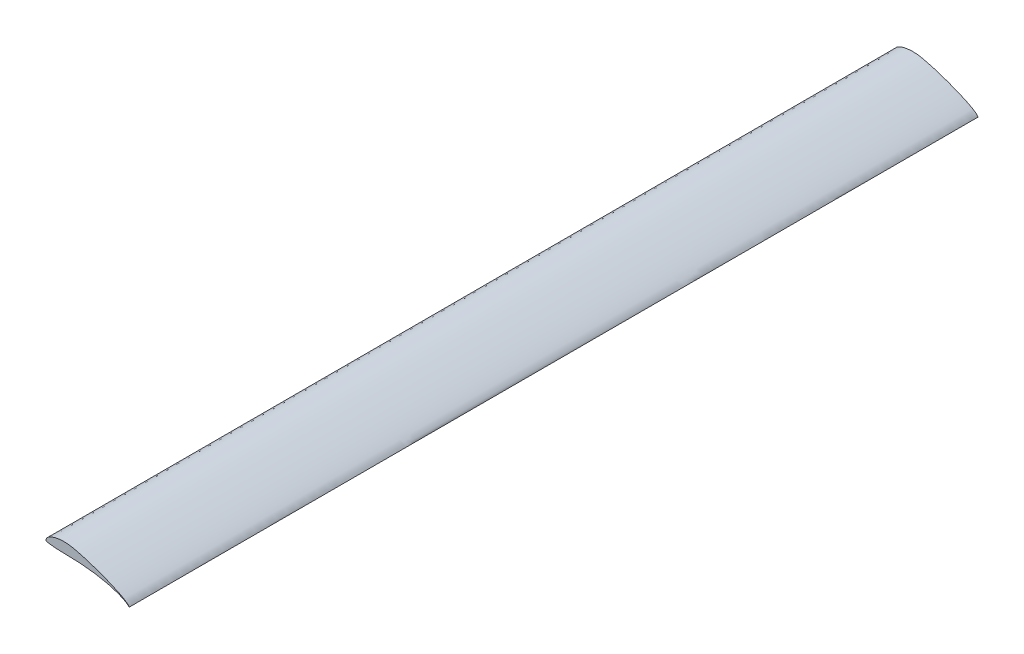
ISO-10303-21;
HEADER;
FILE_DESCRIPTION(('STEP AP214'),'2;1');
FILE_NAME('part.step','',(''),(''),'','','');
FILE_SCHEMA(('AUTOMOTIVE_DESIGN { 1 0 10303 214 1 1 1 1 }'));
ENDSEC;
DATA;
#1=APPLICATION_CONTEXT('core data for automotive mechanical design processes');
#2=APPLICATION_PROTOCOL_DEFINITION('international standard','automotive_design',2000,#1);
#3=PRODUCT_CONTEXT('',#1,'mechanical');
#4=PRODUCT('Part','Part','',(#3));
#5=PRODUCT_RELATED_PRODUCT_CATEGORY('part','',(#4));
#6=PRODUCT_DEFINITION_FORMATION('','',#4);
#7=PRODUCT_DEFINITION_CONTEXT('part definition',#1,'design');
#8=PRODUCT_DEFINITION('design','',#6,#7);
#9=PRODUCT_DEFINITION_SHAPE('','',#8);
#10=(LENGTH_UNIT() NAMED_UNIT(*) SI_UNIT(.MILLI.,.METRE.));
#11=(NAMED_UNIT(*) PLANE_ANGLE_UNIT() SI_UNIT($,.RADIAN.));
#12=(NAMED_UNIT(*) SI_UNIT($,.STERADIAN.) SOLID_ANGLE_UNIT());
#13=UNCERTAINTY_MEASURE_WITH_UNIT(LENGTH_MEASURE(1.E-05),#10,'distance_accuracy_value','');
#14=(GEOMETRIC_REPRESENTATION_CONTEXT(3) GLOBAL_UNCERTAINTY_ASSIGNED_CONTEXT((#13)) GLOBAL_UNIT_ASSIGNED_CONTEXT((#10,
#11,#12)) REPRESENTATION_CONTEXT('',''));
#15=CARTESIAN_POINT('',(0.,0.,0.));
#16=DIRECTION('',(0.,0.,1.));
#17=DIRECTION('',(1.,0.,0.));
#18=AXIS2_PLACEMENT_3D('',#15,#16,#17);
#19=CARTESIAN_POINT('',(17.989875606032,-2.31342529155645,200.));
#20=CARTESIAN_POINT('',(17.9900955759807,-2.31295077492719,200.));
#21=CARTESIAN_POINT('',(17.9355821721171,-2.25171028805099,200.));
#22=CARTESIAN_POINT('',(17.8921271370401,-2.18705956026446,200.));
#23=CARTESIAN_POINT('',(17.7941899806624,-2.05054654714839,200.));
#24=CARTESIAN_POINT('',(17.6759816445532,-1.90243497501113,200.));
#25=CARTESIAN_POINT('',(17.5054846639197,-1.74255060358561,200.));
#26=CARTESIAN_POINT('',(17.286706277002,-1.57657640546879,200.));
#27=CARTESIAN_POINT('',(17.0186805989894,-1.39518516312656,200.));
#28=CARTESIAN_POINT('',(16.7015070323307,-1.20015444271159,200.));
#29=CARTESIAN_POINT('',(16.3366038092009,-0.992692624888009,200.));
#30=CARTESIAN_POINT('',(15.9257740120669,-0.774319819323117,200.));
#31=CARTESIAN_POINT('',(15.4713421218862,-0.54614256974998,200.));
#32=CARTESIAN_POINT('',(14.9757199852916,-0.309893360015332,200.));
#33=CARTESIAN_POINT('',(14.441709218769,-0.067120474682841,200.));
#34=CARTESIAN_POINT('',(13.8724851612771,0.180692698856569,200.));
#35=CARTESIAN_POINT('',(13.2715486730058,0.432153869299972,200.));
#36=CARTESIAN_POINT('',(12.6422489501155,0.685001870645397,200.));
#37=CARTESIAN_POINT('',(11.9886673549607,0.938220063257689,200.));
#38=CARTESIAN_POINT('',(11.3144038220128,1.18953967406809,200.));
#39=CARTESIAN_POINT('',(10.6240058979081,1.43824372063685,200.));
#40=CARTESIAN_POINT('',(9.92186631227948,1.68258343046333,200.));
#41=CARTESIAN_POINT('',(9.21315033148976,1.92117587057976,200.));
#42=CARTESIAN_POINT('',(8.50379949071679,2.15345325871646,200.));
#43=CARTESIAN_POINT('',(7.79939746752808,2.37609093829875,200.));
#44=CARTESIAN_POINT('',(7.10552094655799,2.58648866106916,200.));
#45=CARTESIAN_POINT('',(6.42639332453486,2.77997772947287,200.));
#46=CARTESIAN_POINT('',(5.76538833395988,2.95299745399572,200.));
#47=CARTESIAN_POINT('',(5.12539026782157,3.10073438268136,200.));
#48=CARTESIAN_POINT('',(4.51035220960202,3.22570655871951,200.));
#49=CARTESIAN_POINT('',(3.91903918986305,3.31611377082621,200.));
#50=CARTESIAN_POINT('',(3.35072558378545,3.36957995026956,200.));
#51=CARTESIAN_POINT('',(2.80431112319163,3.39221351392038,200.));
#52=CARTESIAN_POINT('',(2.27962030774589,3.38380811319263,200.));
#53=CARTESIAN_POINT('',(1.77844451885555,3.35045314201531,200.));
#54=CARTESIAN_POINT('',(1.30326803188107,3.29405587149475,200.));
#55=CARTESIAN_POINT('',(0.856694825030588,3.21768739311276,200.));
#56=CARTESIAN_POINT('',(0.441471470520792,3.12168395508999,200.));
#57=CARTESIAN_POINT('',(0.0595426789915003,3.00933040209943,200.));
#58=CARTESIAN_POINT('',(-0.286789882035727,2.88232488069579,200.));
#59=CARTESIAN_POINT('',(-0.595069068977497,2.74284892459154,200.));
#60=CARTESIAN_POINT('',(-0.864334258484831,2.59500680995849,200.));
#61=CARTESIAN_POINT('',(-1.09170154337654,2.43598544788783,200.));
#62=CARTESIAN_POINT('',(-1.2759304370733,2.26731200598163,200.));
#63=CARTESIAN_POINT('',(-1.42157568215839,2.09629836059321,200.));
#64=CARTESIAN_POINT('',(-1.52717283809488,1.92719727195777,200.));
#65=CARTESIAN_POINT('',(-1.59432568538348,1.76487396573081,200.));
#66=CARTESIAN_POINT('',(-1.61751616546988,1.62066595953141,200.));
#67=CARTESIAN_POINT('',(-1.60771691058695,1.48200535980992,200.));
#68=CARTESIAN_POINT('',(-1.48434226282254,1.38876592667072,200.));
#69=CARTESIAN_POINT('',(-1.30232537675106,1.34176299476044,200.));
#70=CARTESIAN_POINT('',(-1.05257716226974,1.28110379727931,200.));
#71=CARTESIAN_POINT('',(-0.733399866275488,1.22959001554564,200.));
#72=CARTESIAN_POINT('',(-0.350647348448999,1.17689579587441,200.));
#73=CARTESIAN_POINT('',(0.0922317685020536,1.127545464913,200.));
#74=CARTESIAN_POINT('',(0.590602883989543,1.08154525422087,200.));
#75=CARTESIAN_POINT('',(1.14233050193094,1.04055035926927,200.));
#76=CARTESIAN_POINT('',(1.74969843745423,1.01697908646355,200.));
#77=CARTESIAN_POINT('',(2.41495394823145,1.0072694181929,200.));
#78=CARTESIAN_POINT('',(3.13842433738461,0.996813392648537,200.));
#79=CARTESIAN_POINT('',(3.91601474934605,0.982949864025493,200.));
#80=CARTESIAN_POINT('',(4.74182303711181,0.960822687616571,200.));
#81=CARTESIAN_POINT('',(5.6089021222364,0.926310274523661,200.));
#82=CARTESIAN_POINT('',(6.50979551598842,0.876137643130922,200.));
#83=CARTESIAN_POINT('',(7.43598875571879,0.807092598183633,200.));
#84=CARTESIAN_POINT('',(8.37866893393879,0.717446400430352,200.));
#85=CARTESIAN_POINT('',(9.32819937243037,0.60449239568797,200.));
#86=CARTESIAN_POINT('',(10.2747901806382,0.468096237432833,200.));
#87=CARTESIAN_POINT('',(11.2082150938344,0.308047474429827,200.));
#88=CARTESIAN_POINT('',(12.118069179501,0.12472809953694,200.));
#89=CARTESIAN_POINT('',(12.9941559711104,-0.0800381776970565,200.));
#90=CARTESIAN_POINT('',(13.8265012571464,-0.303627463356814,200.));
#91=CARTESIAN_POINT('',(14.6051052509501,-0.543307197329443,200.));
#92=CARTESIAN_POINT('',(15.3211131998898,-0.79420883479504,200.));
#93=CARTESIAN_POINT('',(15.9655298240913,-1.05147837614611,200.));
#94=CARTESIAN_POINT('',(16.5313352521414,-1.30949869420793,200.));
#95=CARTESIAN_POINT('',(17.0089756950766,-1.55927210178676,200.));
#96=CARTESIAN_POINT('',(17.3924301587883,-1.79983516114971,200.));
#97=CARTESIAN_POINT('',(17.6595771465929,-2.00273010046639,200.));
#98=CARTESIAN_POINT('',(17.8510635825287,-2.17889781077715,200.));
#99=CARTESIAN_POINT('',(17.9245480817004,-2.24694461471832,200.));
#100=CARTESIAN_POINT('',(17.9896511641142,-2.31390945506588,200.));
#101=CARTESIAN_POINT('',(17.989875606032,-2.31342529155645,200.));
#102=B_SPLINE_CURVE_WITH_KNOTS('',3,(#19,#20,#21,#22,#23,#24,#25,#26,#27,#28,#29,#30,#31,#32,
#33,#34,#35,#36,#37,#38,#39,#40,#41,#42,#43,#44,#45,#46,#47,#48,#49,#50,#51,#52,#53,#54,#55,#56,
#57,#58,#59,#60,#61,#62,#63,#64,#65,#66,#67,#68,#69,#70,#71,#72,#73,#74,#75,#76,#77,#78,#79,#80,
#81,#82,#83,#84,#85,#86,#87,#88,#89,#90,#91,#92,#93,#94,#95,#96,#97,#98,#99,#100,#101),
.UNSPECIFIED.,.T.,.F.,(4,1,1,1,1,1,1,1,1,1,1,1,1,1,1,1,1,1,1,1,1,1,1,1,1,1,1,1,1,1,1,1,1,1,1,1,
1,1,1,1,1,1,1,1,1,1,1,1,1,1,1,1,1,1,1,1,1,1,1,1,1,1,1,1,1,1,1,1,1,1,1,1,1,1,1,1,1,1,1,1,4),(0.,
0.000979677557134127,0.0036488621677631,0.00748349851947815,0.0120952771855933,
0.0175255907768788,0.0240517799938711,0.0317830505527586,0.0406778280832618,0.0507103007904779,
0.0618332290621795,0.0739892504845854,0.0871181731906812,0.101145048769791,0.115990637111827,
0.131570421640589,0.147788379302961,0.164550916882416,0.181757895150531,0.199311954944345,
0.217095071712264,0.234990228463986,0.252856883122009,0.270540593729572,0.287886779266045,
0.304773437599674,0.321101419214061,0.336806063174811,0.351800032584037,0.366031063392082,
0.379615674919835,0.392652962879186,0.405170358707495,0.417171919049936,0.428603516911185,
0.439418959108259,0.449596586064162,0.459102079103161,0.467907877534646,0.475988300736527,
0.483308968746149,0.489874507816402,0.495803249719207,0.501149411695552,0.50590307325604,
0.510046768536663,0.513579310681042,0.516446926626751,0.5193500525909,0.523823355179486,
0.529973793997694,0.537715654387927,0.546967844488146,0.55763736682571,0.569620481096633,
0.582804124215616,0.597246960791632,0.613135036654701,0.630443600329816,0.649056123608545,
0.668822256795696,0.689594964002684,0.711189650864602,0.733426688964389,0.756094117504156,
0.778988553684861,0.801889682684955,0.824566597829707,0.846792284880412,0.868338290507787,
0.888978162959066,0.908492011340558,0.926658767581933,0.943286193042322,0.958169210358795,
0.971135821634751,0.981955623079976,0.990251791025976,0.995852565249962,0.999000405686701,1.),.UNSPECIFIED.);
#103=DIRECTION('',(0.,0.,-1.));
#104=VECTOR('',#103,1.);
#105=SURFACE_OF_LINEAR_EXTRUSION('',#102,#104);
#106=CARTESIAN_POINT('',(17.989875606032,-2.31342529155645,200.));
#107=VERTEX_POINT('',#106);
#108=EDGE_CURVE('E10',#107,#107,#102,.T.);
#109=ORIENTED_EDGE('',*,*,#108,.F.);
#110=EDGE_LOOP('',(#109));
#111=FACE_BOUND('',#110,.T.);
#112=CARTESIAN_POINT('',(17.989875606032,-2.31342529155645,0.));
#113=CARTESIAN_POINT('',(17.9900955759807,-2.31295077492719,0.));
#114=CARTESIAN_POINT('',(17.9355821721171,-2.25171028805099,0.));
#115=CARTESIAN_POINT('',(17.8921271370401,-2.18705956026446,0.));
#116=CARTESIAN_POINT('',(17.7941899806624,-2.05054654714839,0.));
#117=CARTESIAN_POINT('',(17.6759816445532,-1.90243497501113,0.));
#118=CARTESIAN_POINT('',(17.5054846639197,-1.74255060358561,0.));
#119=CARTESIAN_POINT('',(17.286706277002,-1.57657640546879,0.));
#120=CARTESIAN_POINT('',(17.0186805989894,-1.39518516312656,0.));
#121=CARTESIAN_POINT('',(16.7015070323307,-1.20015444271159,0.));
#122=CARTESIAN_POINT('',(16.3366038092009,-0.992692624888009,0.));
#123=CARTESIAN_POINT('',(15.9257740120669,-0.774319819323117,0.));
#124=CARTESIAN_POINT('',(15.4713421218862,-0.54614256974998,0.));
#125=CARTESIAN_POINT('',(14.9757199852916,-0.309893360015332,0.));
#126=CARTESIAN_POINT('',(14.441709218769,-0.067120474682841,0.));
#127=CARTESIAN_POINT('',(13.8724851612771,0.180692698856569,0.));
#128=CARTESIAN_POINT('',(13.2715486730058,0.432153869299972,0.));
#129=CARTESIAN_POINT('',(12.6422489501155,0.685001870645397,0.));
#130=CARTESIAN_POINT('',(11.9886673549607,0.938220063257689,0.));
#131=CARTESIAN_POINT('',(11.3144038220128,1.18953967406809,0.));
#132=CARTESIAN_POINT('',(10.6240058979081,1.43824372063685,0.));
#133=CARTESIAN_POINT('',(9.92186631227948,1.68258343046333,0.));
#134=CARTESIAN_POINT('',(9.21315033148976,1.92117587057976,0.));
#135=CARTESIAN_POINT('',(8.50379949071679,2.15345325871646,0.));
#136=CARTESIAN_POINT('',(7.79939746752808,2.37609093829875,0.));
#137=CARTESIAN_POINT('',(7.10552094655799,2.58648866106916,0.));
#138=CARTESIAN_POINT('',(6.42639332453486,2.77997772947287,0.));
#139=CARTESIAN_POINT('',(5.76538833395988,2.95299745399572,0.));
#140=CARTESIAN_POINT('',(5.12539026782157,3.10073438268136,0.));
#141=CARTESIAN_POINT('',(4.51035220960202,3.22570655871951,0.));
#142=CARTESIAN_POINT('',(3.91903918986305,3.31611377082621,0.));
#143=CARTESIAN_POINT('',(3.35072558378545,3.36957995026956,0.));
#144=CARTESIAN_POINT('',(2.80431112319163,3.39221351392038,0.));
#145=CARTESIAN_POINT('',(2.27962030774589,3.38380811319263,0.));
#146=CARTESIAN_POINT('',(1.77844451885555,3.35045314201531,0.));
#147=CARTESIAN_POINT('',(1.30326803188107,3.29405587149475,0.));
#148=CARTESIAN_POINT('',(0.856694825030588,3.21768739311276,0.));
#149=CARTESIAN_POINT('',(0.441471470520792,3.12168395508999,0.));
#150=CARTESIAN_POINT('',(0.0595426789915003,3.00933040209943,0.));
#151=CARTESIAN_POINT('',(-0.286789882035727,2.88232488069579,0.));
#152=CARTESIAN_POINT('',(-0.595069068977497,2.74284892459154,0.));
#153=CARTESIAN_POINT('',(-0.864334258484831,2.59500680995849,0.));
#154=CARTESIAN_POINT('',(-1.09170154337654,2.43598544788783,0.));
#155=CARTESIAN_POINT('',(-1.2759304370733,2.26731200598163,0.));
#156=CARTESIAN_POINT('',(-1.42157568215839,2.09629836059321,0.));
#157=CARTESIAN_POINT('',(-1.52717283809488,1.92719727195777,0.));
#158=CARTESIAN_POINT('',(-1.59432568538348,1.76487396573081,0.));
#159=CARTESIAN_POINT('',(-1.61751616546988,1.62066595953141,0.));
#160=CARTESIAN_POINT('',(-1.60771691058695,1.48200535980992,0.));
#161=CARTESIAN_POINT('',(-1.48434226282254,1.38876592667072,0.));
#162=CARTESIAN_POINT('',(-1.30232537675106,1.34176299476044,0.));
#163=CARTESIAN_POINT('',(-1.05257716226974,1.28110379727931,0.));
#164=CARTESIAN_POINT('',(-0.733399866275488,1.22959001554564,0.));
#165=CARTESIAN_POINT('',(-0.350647348448999,1.17689579587441,0.));
#166=CARTESIAN_POINT('',(0.0922317685020536,1.127545464913,0.));
#167=CARTESIAN_POINT('',(0.590602883989543,1.08154525422087,0.));
#168=CARTESIAN_POINT('',(1.14233050193094,1.04055035926927,0.));
#169=CARTESIAN_POINT('',(1.74969843745423,1.01697908646355,0.));
#170=CARTESIAN_POINT('',(2.41495394823145,1.0072694181929,0.));
#171=CARTESIAN_POINT('',(3.13842433738461,0.996813392648537,0.));
#172=CARTESIAN_POINT('',(3.91601474934605,0.982949864025493,0.));
#173=CARTESIAN_POINT('',(4.74182303711181,0.960822687616571,0.));
#174=CARTESIAN_POINT('',(5.6089021222364,0.926310274523661,0.));
#175=CARTESIAN_POINT('',(6.50979551598842,0.876137643130922,0.));
#176=CARTESIAN_POINT('',(7.43598875571879,0.807092598183633,0.));
#177=CARTESIAN_POINT('',(8.37866893393879,0.717446400430352,0.));
#178=CARTESIAN_POINT('',(9.32819937243037,0.60449239568797,0.));
#179=CARTESIAN_POINT('',(10.2747901806382,0.468096237432833,0.));
#180=CARTESIAN_POINT('',(11.2082150938344,0.308047474429827,0.));
#181=CARTESIAN_POINT('',(12.118069179501,0.12472809953694,0.));
#182=CARTESIAN_POINT('',(12.9941559711104,-0.0800381776970565,0.));
#183=CARTESIAN_POINT('',(13.8265012571464,-0.303627463356814,0.));
#184=CARTESIAN_POINT('',(14.6051052509501,-0.543307197329443,0.));
#185=CARTESIAN_POINT('',(15.3211131998898,-0.79420883479504,0.));
#186=CARTESIAN_POINT('',(15.9655298240913,-1.05147837614611,0.));
#187=CARTESIAN_POINT('',(16.5313352521414,-1.30949869420793,0.));
#188=CARTESIAN_POINT('',(17.0089756950766,-1.55927210178676,0.));
#189=CARTESIAN_POINT('',(17.3924301587883,-1.79983516114971,0.));
#190=CARTESIAN_POINT('',(17.6595771465929,-2.00273010046639,0.));
#191=CARTESIAN_POINT('',(17.8510635825287,-2.17889781077715,0.));
#192=CARTESIAN_POINT('',(17.9245480817004,-2.24694461471832,0.));
#193=CARTESIAN_POINT('',(17.9896511641142,-2.31390945506588,0.));
#194=CARTESIAN_POINT('',(17.989875606032,-2.31342529155645,0.));
#195=B_SPLINE_CURVE_WITH_KNOTS('',3,(#112,#113,#114,#115,#116,#117,#118,#119,#120,#121,#122,
#123,#124,#125,#126,#127,#128,#129,#130,#131,#132,#133,#134,#135,#136,#137,#138,#139,#140,#141,
#142,#143,#144,#145,#146,#147,#148,#149,#150,#151,#152,#153,#154,#155,#156,#157,#158,#159,#160,
#161,#162,#163,#164,#165,#166,#167,#168,#169,#170,#171,#172,#173,#174,#175,#176,#177,#178,#179,
#180,#181,#182,#183,#184,#185,#186,#187,#188,#189,#190,#191,#192,#193,#194),.UNSPECIFIED.,.T.,
.F.,(4,1,1,1,1,1,1,1,1,1,1,1,1,1,1,1,1,1,1,1,1,1,1,1,1,1,1,1,1,1,1,1,1,1,1,1,1,1,1,1,1,1,1,1,1,
1,1,1,1,1,1,1,1,1,1,1,1,1,1,1,1,1,1,1,1,1,1,1,1,1,1,1,1,1,1,1,1,1,1,1,4),(0.,
0.000979677557134127,0.0036488621677631,0.00748349851947815,0.0120952771855933,
0.0175255907768788,0.0240517799938711,0.0317830505527586,0.0406778280832618,0.0507103007904779,
0.0618332290621795,0.0739892504845854,0.0871181731906812,0.101145048769791,0.115990637111827,
0.131570421640589,0.147788379302961,0.164550916882416,0.181757895150531,0.199311954944345,
0.217095071712264,0.234990228463986,0.252856883122009,0.270540593729572,0.287886779266045,
0.304773437599674,0.321101419214061,0.336806063174811,0.351800032584037,0.366031063392082,
0.379615674919835,0.392652962879186,0.405170358707495,0.417171919049936,0.428603516911185,
0.439418959108259,0.449596586064162,0.459102079103161,0.467907877534646,0.475988300736527,
0.483308968746149,0.489874507816402,0.495803249719207,0.501149411695552,0.50590307325604,
0.510046768536663,0.513579310681042,0.516446926626751,0.5193500525909,0.523823355179486,
0.529973793997694,0.537715654387927,0.546967844488146,0.55763736682571,0.569620481096633,
0.582804124215616,0.597246960791632,0.613135036654701,0.630443600329816,0.649056123608545,
0.668822256795696,0.689594964002684,0.711189650864602,0.733426688964389,0.756094117504156,
0.778988553684861,0.801889682684955,0.824566597829707,0.846792284880412,0.868338290507787,
0.888978162959066,0.908492011340558,0.926658767581933,0.943286193042322,0.958169210358795,
0.971135821634751,0.981955623079976,0.990251791025976,0.995852565249962,0.999000405686701,1.),.UNSPECIFIED.);
#196=CARTESIAN_POINT('',(17.989875606032,-2.31342529155645,0.));
#197=VERTEX_POINT('',#196);
#198=EDGE_CURVE('E41',#197,#197,#195,.T.);
#199=ORIENTED_EDGE('',*,*,#198,.T.);
#200=EDGE_LOOP('',(#199));
#201=FACE_BOUND('',#200,.T.);
#202=ADVANCED_FACE('F37',(#111,#201),#105,.F.);
#203=CARTESIAN_POINT('',(-1.39330540960779,2.12508985086769,200.));
#204=DIRECTION('',(0.,0.,-1.));
#205=DIRECTION('',(-1.,0.,0.));
#206=AXIS2_PLACEMENT_3D('',#203,#204,#205);
#207=PLANE('',#206);
#208=ORIENTED_EDGE('',*,*,#108,.T.);
#209=EDGE_LOOP('',(#208));
#210=FACE_BOUND('',#209,.T.);
#211=ADVANCED_FACE('F60',(#210),#207,.F.);
#212=CARTESIAN_POINT('',(-1.39330540960779,2.12508985086769,0.));
#213=DIRECTION('',(0.,0.,-1.));
#214=DIRECTION('',(-1.,0.,0.));
#215=AXIS2_PLACEMENT_3D('',#212,#213,#214);
#216=PLANE('',#215);
#217=ORIENTED_EDGE('',*,*,#198,.F.);
#218=EDGE_LOOP('',(#217));
#219=FACE_BOUND('',#218,.T.);
#220=ADVANCED_FACE('F58',(#219),#216,.T.);
#221=CLOSED_SHELL('',(#202,#211,#220));
#222=MANIFOLD_SOLID_BREP('B2',#221);
#223=ADVANCED_BREP_SHAPE_REPRESENTATION('',(#18,#222),#14);
#224=SHAPE_DEFINITION_REPRESENTATION(#9,#223);
ENDSEC;
END-ISO-10303-21;
